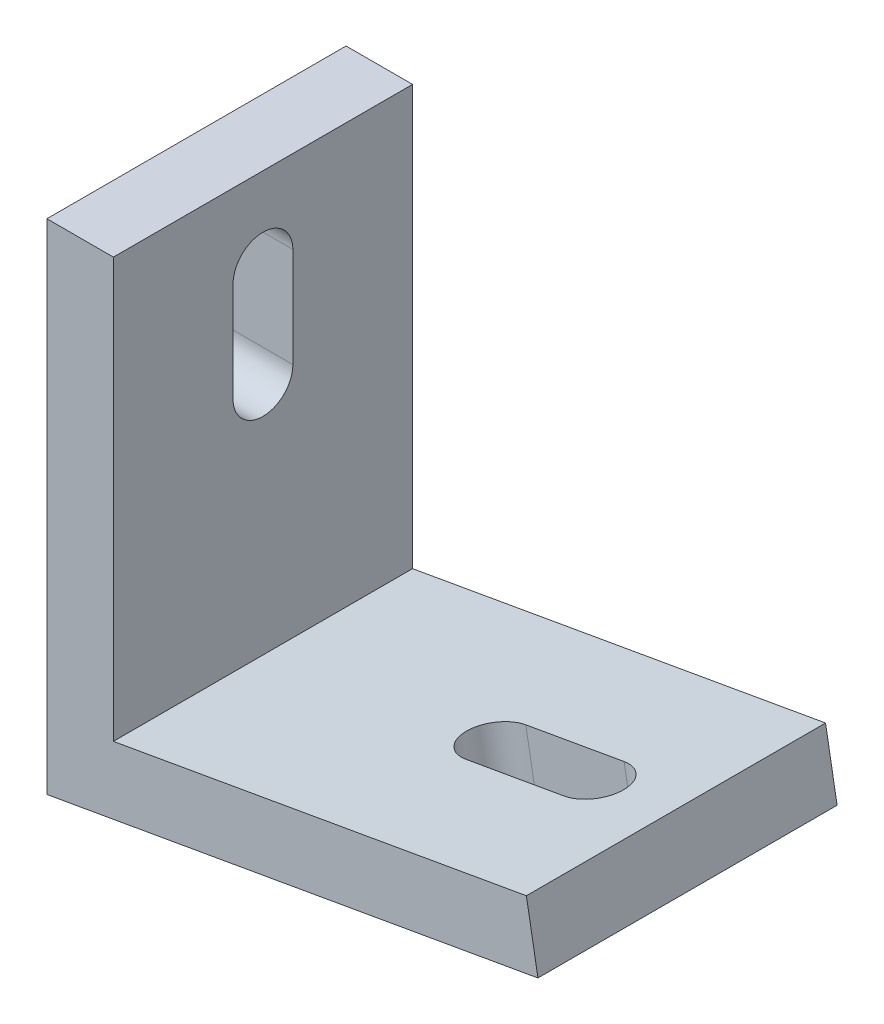
ISO-10303-21;
HEADER;
FILE_DESCRIPTION(('STEP AP214'),'2;1');
FILE_NAME('part.step','',(''),(''),'','','');
FILE_SCHEMA(('AUTOMOTIVE_DESIGN { 1 0 10303 214 1 1 1 1 }'));
ENDSEC;
DATA;
#1=APPLICATION_CONTEXT('core data for automotive mechanical design processes');
#2=APPLICATION_PROTOCOL_DEFINITION('international standard','automotive_design',2000,#1);
#3=PRODUCT_CONTEXT('',#1,'mechanical');
#4=PRODUCT('Part','Part','',(#3));
#5=PRODUCT_RELATED_PRODUCT_CATEGORY('part','',(#4));
#6=PRODUCT_DEFINITION_FORMATION('','',#4);
#7=PRODUCT_DEFINITION_CONTEXT('part definition',#1,'design');
#8=PRODUCT_DEFINITION('design','',#6,#7);
#9=PRODUCT_DEFINITION_SHAPE('','',#8);
#10=(LENGTH_UNIT() NAMED_UNIT(*) SI_UNIT(.MILLI.,.METRE.));
#11=(NAMED_UNIT(*) PLANE_ANGLE_UNIT() SI_UNIT($,.RADIAN.));
#12=(NAMED_UNIT(*) SI_UNIT($,.STERADIAN.) SOLID_ANGLE_UNIT());
#13=UNCERTAINTY_MEASURE_WITH_UNIT(LENGTH_MEASURE(1.E-05),#10,'distance_accuracy_value','');
#14=(GEOMETRIC_REPRESENTATION_CONTEXT(3) GLOBAL_UNCERTAINTY_ASSIGNED_CONTEXT((#13)) GLOBAL_UNIT_ASSIGNED_CONTEXT((#10,
#11,#12)) REPRESENTATION_CONTEXT('',''));
#15=CARTESIAN_POINT('',(0.,0.,0.));
#16=DIRECTION('',(0.,0.,1.));
#17=DIRECTION('',(1.,0.,0.));
#18=AXIS2_PLACEMENT_3D('',#15,#16,#17);
#19=CARTESIAN_POINT('',(72.1240996992464,22.8716908551416,22.5));
#20=DIRECTION('',(0.173648177666928,-0.984807753012208,0.));
#21=DIRECTION('',(0.984807753012209,0.173648177666928,0.));
#22=AXIS2_PLACEMENT_3D('',#19,#20,#21);
#23=PLANE('',#22);
#24=DIRECTION('',(-0.984807753012209,-0.173648177666928,0.));
#25=VECTOR('',#24,1.);
#26=CARTESIAN_POINT('',(72.1240996992464,22.8716908551416,-22.5));
#27=LINE('',#26,#25);
#28=CARTESIAN_POINT('',(72.1240996992464,22.8716908551416,-22.5));
#29=VERTEX_POINT('',#28);
#30=CARTESIAN_POINT('',(10.,11.917535925942,-22.5));
#31=VERTEX_POINT('',#30);
#32=EDGE_CURVE('E363',#29,#31,#27,.T.);
#33=ORIENTED_EDGE('',*,*,#32,.T.);
#34=DIRECTION('',(0.,0.,-1.));
#35=VECTOR('',#34,1.);
#36=CARTESIAN_POINT('',(10.,11.917535925942,22.5));
#37=LINE('',#36,#35);
#38=CARTESIAN_POINT('',(10.,11.917535925942,22.5));
#39=VERTEX_POINT('',#38);
#40=EDGE_CURVE('E377',#39,#31,#37,.T.);
#41=ORIENTED_EDGE('',*,*,#40,.F.);
#42=DIRECTION('',(-0.984807753012209,-0.173648177666928,0.));
#43=VECTOR('',#42,1.);
#44=CARTESIAN_POINT('',(72.1240996992464,22.8716908551416,22.5));
#45=LINE('',#44,#43);
#46=CARTESIAN_POINT('',(72.1240996992464,22.8716908551416,22.5));
#47=VERTEX_POINT('',#46);
#48=EDGE_CURVE('E349',#47,#39,#45,.T.);
#49=ORIENTED_EDGE('',*,*,#48,.F.);
#50=DIRECTION('',(0.,0.,-1.));
#51=VECTOR('',#50,1.);
#52=CARTESIAN_POINT('',(72.1240996992464,22.8716908551416,22.5));
#53=LINE('',#52,#51);
#54=EDGE_CURVE('E374',#47,#29,#53,.T.);
#55=ORIENTED_EDGE('',*,*,#54,.T.);
#56=EDGE_LOOP('',(#33,#41,#49,#55));
#57=FACE_BOUND('',#56,.T.);
#58=DIRECTION('',(0.984807753012209,0.173648177666928,0.));
#59=VECTOR('',#58,1.);
#60=CARTESIAN_POINT('',(72.1240996992464,22.8716908551416,4.49999999999999));
#61=LINE('',#60,#59);
#62=CARTESIAN_POINT('',(45.0418864914106,18.0963659693011,4.5));
#63=VERTEX_POINT('',#62);
#64=CARTESIAN_POINT('',(59.8140027865938,20.701088634305,4.5));
#65=VERTEX_POINT('',#64);
#66=EDGE_CURVE('E13',#63,#65,#61,.T.);
#67=ORIENTED_EDGE('',*,*,#66,.F.);
#68=CARTESIAN_POINT('',(45.0418864914106,18.0963659693011,0.));
#69=DIRECTION('',(0.173648177666928,-0.984807753012208,0.));
#70=DIRECTION('',(0.984807753012209,0.173648177666928,0.));
#71=AXIS2_PLACEMENT_3D('',#68,#69,#70);
#72=CIRCLE('',#71,4.5);
#73=CARTESIAN_POINT('',(45.0418864914106,18.0963659693011,-4.5));
#74=VERTEX_POINT('',#73);
#75=EDGE_CURVE('E398',#63,#74,#72,.T.);
#76=ORIENTED_EDGE('',*,*,#75,.T.);
#77=DIRECTION('',(0.984807753012209,0.173648177666928,0.));
#78=VECTOR('',#77,1.);
#79=CARTESIAN_POINT('',(72.1240996992464,22.8716908551416,-4.5));
#80=LINE('',#79,#78);
#81=CARTESIAN_POINT('',(59.8140027865938,20.701088634305,-4.5));
#82=VERTEX_POINT('',#81);
#83=EDGE_CURVE('E395',#74,#82,#80,.T.);
#84=ORIENTED_EDGE('',*,*,#83,.T.);
#85=CARTESIAN_POINT('',(59.8140027865938,20.701088634305,0.));
#86=DIRECTION('',(0.173648177666928,-0.984807753012208,0.));
#87=DIRECTION('',(0.984807753012209,0.173648177666928,0.));
#88=AXIS2_PLACEMENT_3D('',#85,#86,#87);
#89=CIRCLE('',#88,4.5);
#90=EDGE_CURVE('E199',#82,#65,#89,.T.);
#91=ORIENTED_EDGE('',*,*,#90,.T.);
#92=EDGE_LOOP('',(#67,#76,#84,#91));
#93=FACE_BOUND('',#92,.T.);
#94=ADVANCED_FACE('F191',(#57,#93),#23,.F.);
#95=CARTESIAN_POINT('',(0.,0.,22.5));
#96=DIRECTION('',(-1.,0.,0.));
#97=DIRECTION('',(0.,0.,1.));
#98=AXIS2_PLACEMENT_3D('',#95,#96,#97);
#99=PLANE('',#98);
#100=CARTESIAN_POINT('',(0.,62.5,0.));
#101=DIRECTION('',(-1.,0.,0.));
#102=DIRECTION('',(0.,0.,1.));
#103=AXIS2_PLACEMENT_3D('',#100,#101,#102);
#104=CIRCLE('',#103,4.5);
#105=CARTESIAN_POINT('',(0.,62.5,4.49999999999998));
#106=VERTEX_POINT('',#105);
#107=CARTESIAN_POINT('',(0.,62.5,-4.5));
#108=VERTEX_POINT('',#107);
#109=EDGE_CURVE('E332',#106,#108,#104,.T.);
#110=ORIENTED_EDGE('',*,*,#109,.F.);
#111=DIRECTION('',(0.,1.,0.));
#112=VECTOR('',#111,1.);
#113=CARTESIAN_POINT('',(0.,47.5,4.49999999999998));
#114=LINE('',#113,#112);
#115=CARTESIAN_POINT('',(0.,47.5,4.5));
#116=VERTEX_POINT('',#115);
#117=EDGE_CURVE('E319',#116,#106,#114,.T.);
#118=ORIENTED_EDGE('',*,*,#117,.F.);
#119=CARTESIAN_POINT('',(0.,47.5,0.));
#120=DIRECTION('',(-1.,0.,0.));
#121=DIRECTION('',(0.,0.,1.));
#122=AXIS2_PLACEMENT_3D('',#119,#120,#121);
#123=CIRCLE('',#122,4.5);
#124=CARTESIAN_POINT('',(0.,47.5,-4.5));
#125=VERTEX_POINT('',#124);
#126=EDGE_CURVE('E324',#125,#116,#123,.T.);
#127=ORIENTED_EDGE('',*,*,#126,.F.);
#128=DIRECTION('',(0.,1.,0.));
#129=VECTOR('',#128,1.);
#130=CARTESIAN_POINT('',(0.,47.5,-4.5));
#131=LINE('',#130,#129);
#132=EDGE_CURVE('E321',#125,#108,#131,.T.);
#133=ORIENTED_EDGE('',*,*,#132,.T.);
#134=EDGE_LOOP('',(#110,#118,#127,#133));
#135=FACE_BOUND('',#134,.T.);
#136=DIRECTION('',(0.,1.,0.));
#137=VECTOR('',#136,1.);
#138=CARTESIAN_POINT('',(0.,0.,-22.5));
#139=LINE('',#138,#137);
#140=CARTESIAN_POINT('',(0.,0.,-22.5));
#141=VERTEX_POINT('',#140);
#142=CARTESIAN_POINT('',(0.,75.,-22.5));
#143=VERTEX_POINT('',#142);
#144=EDGE_CURVE('E340',#141,#143,#139,.T.);
#145=ORIENTED_EDGE('',*,*,#144,.F.);
#146=DIRECTION('',(0.,0.,-1.));
#147=VECTOR('',#146,1.);
#148=CARTESIAN_POINT('',(0.,0.,22.5));
#149=LINE('',#148,#147);
#150=CARTESIAN_POINT('',(0.,0.,22.5));
#151=VERTEX_POINT('',#150);
#152=EDGE_CURVE('E368',#151,#141,#149,.T.);
#153=ORIENTED_EDGE('',*,*,#152,.F.);
#154=DIRECTION('',(0.,1.,0.));
#155=VECTOR('',#154,1.);
#156=CARTESIAN_POINT('',(0.,0.,22.5));
#157=LINE('',#156,#155);
#158=CARTESIAN_POINT('',(0.,75.,22.5));
#159=VERTEX_POINT('',#158);
#160=EDGE_CURVE('E341',#151,#159,#157,.T.);
#161=ORIENTED_EDGE('',*,*,#160,.T.);
#162=DIRECTION('',(0.,0.,-1.));
#163=VECTOR('',#162,1.);
#164=CARTESIAN_POINT('',(0.,75.,22.5));
#165=LINE('',#164,#163);
#166=EDGE_CURVE('E355',#159,#143,#165,.T.);
#167=ORIENTED_EDGE('',*,*,#166,.T.);
#168=EDGE_LOOP('',(#145,#153,#161,#167));
#169=FACE_BOUND('',#168,.T.);
#170=ADVANCED_FACE('F193',(#135,#169),#99,.T.);
#171=CARTESIAN_POINT('',(0.,0.,22.5));
#172=DIRECTION('',(-0.173648177666927,0.984807753012208,0.));
#173=DIRECTION('',(-0.984807753012209,-0.173648177666927,0.));
#174=AXIS2_PLACEMENT_3D('',#171,#172,#173);
#175=PLANE('',#174);
#176=CARTESIAN_POINT('',(61.550484563263,10.853011104183,0.));
#177=DIRECTION('',(0.173648177666928,-0.984807753012209,0.));
#178=DIRECTION('',(0.984807753012209,0.173648177666928,0.));
#179=AXIS2_PLACEMENT_3D('',#176,#177,#178);
#180=CIRCLE('',#179,4.5);
#181=CARTESIAN_POINT('',(61.550484563263,10.853011104183,-4.49999999999998));
#182=VERTEX_POINT('',#181);
#183=CARTESIAN_POINT('',(61.550484563263,10.853011104183,4.5));
#184=VERTEX_POINT('',#183);
#185=EDGE_CURVE('E291',#182,#184,#180,.T.);
#186=ORIENTED_EDGE('',*,*,#185,.F.);
#187=DIRECTION('',(0.984807753012208,0.173648177666927,0.));
#188=VECTOR('',#187,1.);
#189=CARTESIAN_POINT('',(46.7783682680799,8.24828843917905,-4.49999999999997));
#190=LINE('',#189,#188);
#191=CARTESIAN_POINT('',(46.7783682680799,8.24828843917905,-4.5));
#192=VERTEX_POINT('',#191);
#193=EDGE_CURVE('E311',#192,#182,#190,.T.);
#194=ORIENTED_EDGE('',*,*,#193,.F.);
#195=CARTESIAN_POINT('',(46.7783682680799,8.24828843917905,0.));
#196=DIRECTION('',(0.173648177666928,-0.984807753012209,0.));
#197=DIRECTION('',(0.984807753012209,0.173648177666928,0.));
#198=AXIS2_PLACEMENT_3D('',#195,#196,#197);
#199=CIRCLE('',#198,4.5);
#200=CARTESIAN_POINT('',(46.7783682680799,8.24828843917905,4.5));
#201=VERTEX_POINT('',#200);
#202=EDGE_CURVE('E310',#201,#192,#199,.T.);
#203=ORIENTED_EDGE('',*,*,#202,.F.);
#204=DIRECTION('',(0.984807753012208,0.173648177666927,0.));
#205=VECTOR('',#204,1.);
#206=CARTESIAN_POINT('',(46.7783682680799,8.24828843917905,4.5));
#207=LINE('',#206,#205);
#208=EDGE_CURVE('E304',#201,#184,#207,.T.);
#209=ORIENTED_EDGE('',*,*,#208,.T.);
#210=EDGE_LOOP('',(#186,#194,#203,#209));
#211=FACE_BOUND('',#210,.T.);
#212=DIRECTION('',(0.984807753012208,0.173648177666927,0.));
#213=VECTOR('',#212,1.);
#214=CARTESIAN_POINT('',(0.,0.,-22.5));
#215=LINE('',#214,#213);
#216=CARTESIAN_POINT('',(73.8605814759156,13.0236133250196,-22.5));
#217=VERTEX_POINT('',#216);
#218=EDGE_CURVE('E345',#141,#217,#215,.T.);
#219=ORIENTED_EDGE('',*,*,#218,.T.);
#220=DIRECTION('',(0.,0.,-1.));
#221=VECTOR('',#220,1.);
#222=CARTESIAN_POINT('',(73.8605814759156,13.0236133250196,22.5));
#223=LINE('',#222,#221);
#224=CARTESIAN_POINT('',(73.8605814759156,13.0236133250196,22.5));
#225=VERTEX_POINT('',#224);
#226=EDGE_CURVE('E371',#225,#217,#223,.T.);
#227=ORIENTED_EDGE('',*,*,#226,.F.);
#228=DIRECTION('',(0.984807753012208,0.173648177666927,0.));
#229=VECTOR('',#228,1.);
#230=CARTESIAN_POINT('',(0.,0.,22.5));
#231=LINE('',#230,#229);
#232=EDGE_CURVE('E353',#151,#225,#231,.T.);
#233=ORIENTED_EDGE('',*,*,#232,.F.);
#234=ORIENTED_EDGE('',*,*,#152,.T.);
#235=EDGE_LOOP('',(#219,#227,#233,#234));
#236=FACE_BOUND('',#235,.T.);
#237=ADVANCED_FACE('F308',(#211,#236),#175,.F.);
#238=CARTESIAN_POINT('',(73.8605814759156,13.0236133250196,22.5));
#239=DIRECTION('',(-0.984807753012208,-0.173648177666928,0.));
#240=DIRECTION('',(0.173648177666928,-0.984807753012209,0.));
#241=AXIS2_PLACEMENT_3D('',#238,#239,#240);
#242=PLANE('',#241);
#243=DIRECTION('',(-0.173648177666928,0.984807753012209,0.));
#244=VECTOR('',#243,1.);
#245=CARTESIAN_POINT('',(73.8605814759156,13.0236133250196,-22.5));
#246=LINE('',#245,#244);
#247=EDGE_CURVE('E365',#217,#29,#246,.T.);
#248=ORIENTED_EDGE('',*,*,#247,.T.);
#249=ORIENTED_EDGE('',*,*,#54,.F.);
#250=DIRECTION('',(-0.173648177666928,0.984807753012209,0.));
#251=VECTOR('',#250,1.);
#252=CARTESIAN_POINT('',(73.8605814759156,13.0236133250196,22.5));
#253=LINE('',#252,#251);
#254=EDGE_CURVE('E351',#225,#47,#253,.T.);
#255=ORIENTED_EDGE('',*,*,#254,.F.);
#256=ORIENTED_EDGE('',*,*,#226,.T.);
#257=EDGE_LOOP('',(#248,#249,#255,#256));
#258=FACE_BOUND('',#257,.T.);
#259=ADVANCED_FACE('F424',(#258),#242,.F.);
#260=CARTESIAN_POINT('',(10.,11.917535925942,22.5));
#261=DIRECTION('',(-1.,0.,0.));
#262=DIRECTION('',(0.,-1.,0.));
#263=AXIS2_PLACEMENT_3D('',#260,#261,#262);
#264=PLANE('',#263);
#265=CARTESIAN_POINT('',(10.,62.5,0.));
#266=DIRECTION('',(-1.,0.,0.));
#267=DIRECTION('',(0.,-1.,0.));
#268=AXIS2_PLACEMENT_3D('',#265,#266,#267);
#269=CIRCLE('',#268,4.5);
#270=CARTESIAN_POINT('',(10.,62.5,4.5));
#271=VERTEX_POINT('',#270);
#272=CARTESIAN_POINT('',(10.,62.5,-4.5));
#273=VERTEX_POINT('',#272);
#274=EDGE_CURVE('E389',#271,#273,#269,.T.);
#275=ORIENTED_EDGE('',*,*,#274,.T.);
#276=DIRECTION('',(0.,-1.,0.));
#277=VECTOR('',#276,1.);
#278=CARTESIAN_POINT('',(10.,11.917535925942,-4.49999999999999));
#279=LINE('',#278,#277);
#280=CARTESIAN_POINT('',(10.,47.5,-4.5));
#281=VERTEX_POINT('',#280);
#282=EDGE_CURVE('E392',#273,#281,#279,.T.);
#283=ORIENTED_EDGE('',*,*,#282,.T.);
#284=CARTESIAN_POINT('',(10.,47.5,0.));
#285=DIRECTION('',(-1.,0.,0.));
#286=DIRECTION('',(0.,-1.,0.));
#287=AXIS2_PLACEMENT_3D('',#284,#285,#286);
#288=CIRCLE('',#287,4.5);
#289=CARTESIAN_POINT('',(10.,47.5,4.5));
#290=VERTEX_POINT('',#289);
#291=EDGE_CURVE('E386',#281,#290,#288,.T.);
#292=ORIENTED_EDGE('',*,*,#291,.T.);
#293=DIRECTION('',(0.,1.,0.));
#294=VECTOR('',#293,1.);
#295=CARTESIAN_POINT('',(10.,11.917535925942,4.5));
#296=LINE('',#295,#294);
#297=EDGE_CURVE('E370',#290,#271,#296,.T.);
#298=ORIENTED_EDGE('',*,*,#297,.T.);
#299=EDGE_LOOP('',(#275,#283,#292,#298));
#300=FACE_BOUND('',#299,.T.);
#301=DIRECTION('',(0.,1.,0.));
#302=VECTOR('',#301,1.);
#303=CARTESIAN_POINT('',(10.,11.917535925942,-22.5));
#304=LINE('',#303,#302);
#305=CARTESIAN_POINT('',(10.,75.,-22.5));
#306=VERTEX_POINT('',#305);
#307=EDGE_CURVE('E361',#31,#306,#304,.T.);
#308=ORIENTED_EDGE('',*,*,#307,.T.);
#309=DIRECTION('',(0.,0.,-1.));
#310=VECTOR('',#309,1.);
#311=CARTESIAN_POINT('',(10.,75.,22.5));
#312=LINE('',#311,#310);
#313=CARTESIAN_POINT('',(10.,75.,22.5));
#314=VERTEX_POINT('',#313);
#315=EDGE_CURVE('E380',#314,#306,#312,.T.);
#316=ORIENTED_EDGE('',*,*,#315,.F.);
#317=DIRECTION('',(0.,1.,0.));
#318=VECTOR('',#317,1.);
#319=CARTESIAN_POINT('',(10.,11.917535925942,22.5));
#320=LINE('',#319,#318);
#321=EDGE_CURVE('E347',#39,#314,#320,.T.);
#322=ORIENTED_EDGE('',*,*,#321,.F.);
#323=ORIENTED_EDGE('',*,*,#40,.T.);
#324=EDGE_LOOP('',(#308,#316,#322,#323));
#325=FACE_BOUND('',#324,.T.);
#326=ADVANCED_FACE('F426',(#300,#325),#264,.F.);
#327=CARTESIAN_POINT('',(10.,75.,22.5));
#328=DIRECTION('',(0.,-1.,0.));
#329=DIRECTION('',(0.,0.,-1.));
#330=AXIS2_PLACEMENT_3D('',#327,#328,#329);
#331=PLANE('',#330);
#332=DIRECTION('',(-1.,0.,0.));
#333=VECTOR('',#332,1.);
#334=CARTESIAN_POINT('',(10.,75.,-22.5));
#335=LINE('',#334,#333);
#336=EDGE_CURVE('E358',#306,#143,#335,.T.);
#337=ORIENTED_EDGE('',*,*,#336,.T.);
#338=ORIENTED_EDGE('',*,*,#166,.F.);
#339=DIRECTION('',(-1.,0.,0.));
#340=VECTOR('',#339,1.);
#341=CARTESIAN_POINT('',(10.,75.,22.5));
#342=LINE('',#341,#340);
#343=EDGE_CURVE('E344',#314,#159,#342,.T.);
#344=ORIENTED_EDGE('',*,*,#343,.F.);
#345=ORIENTED_EDGE('',*,*,#315,.T.);
#346=EDGE_LOOP('',(#337,#338,#344,#345));
#347=FACE_BOUND('',#346,.T.);
#348=ADVANCED_FACE('F428',(#347),#331,.F.);
#349=CARTESIAN_POINT('',(0.,0.,22.5));
#350=DIRECTION('',(0.,0.,1.));
#351=DIRECTION('',(1.,0.,0.));
#352=AXIS2_PLACEMENT_3D('',#349,#350,#351);
#353=PLANE('',#352);
#354=ORIENTED_EDGE('',*,*,#160,.F.);
#355=ORIENTED_EDGE('',*,*,#232,.T.);
#356=ORIENTED_EDGE('',*,*,#254,.T.);
#357=ORIENTED_EDGE('',*,*,#48,.T.);
#358=ORIENTED_EDGE('',*,*,#321,.T.);
#359=ORIENTED_EDGE('',*,*,#343,.T.);
#360=EDGE_LOOP('',(#354,#355,#356,#357,#358,#359));
#361=FACE_BOUND('',#360,.T.);
#362=ADVANCED_FACE('F431',(#361),#353,.T.);
#363=CARTESIAN_POINT('',(0.,0.,-22.5));
#364=DIRECTION('',(0.,0.,1.));
#365=DIRECTION('',(1.,0.,0.));
#366=AXIS2_PLACEMENT_3D('',#363,#364,#365);
#367=PLANE('',#366);
#368=ORIENTED_EDGE('',*,*,#144,.T.);
#369=ORIENTED_EDGE('',*,*,#336,.F.);
#370=ORIENTED_EDGE('',*,*,#307,.F.);
#371=ORIENTED_EDGE('',*,*,#32,.F.);
#372=ORIENTED_EDGE('',*,*,#247,.F.);
#373=ORIENTED_EDGE('',*,*,#218,.F.);
#374=EDGE_LOOP('',(#368,#369,#370,#371,#372,#373));
#375=FACE_BOUND('',#374,.T.);
#376=ADVANCED_FACE('F437',(#375),#367,.F.);
#377=CARTESIAN_POINT('',(0.,62.5,0.));
#378=DIRECTION('',(-1.,0.,0.));
#379=DIRECTION('',(0.,0.,1.));
#380=AXIS2_PLACEMENT_3D('',#377,#378,#379);
#381=CYLINDRICAL_SURFACE('',#380,4.5);
#382=DIRECTION('',(-1.,0.,0.));
#383=VECTOR('',#382,1.);
#384=CARTESIAN_POINT('',(0.,62.5,4.5));
#385=LINE('',#384,#383);
#386=EDGE_CURVE('E337',#106,#271,#385,.F.);
#387=ORIENTED_EDGE('',*,*,#386,.F.);
#388=ORIENTED_EDGE('',*,*,#109,.T.);
#389=DIRECTION('',(-1.,0.,0.));
#390=VECTOR('',#389,1.);
#391=CARTESIAN_POINT('',(0.,62.5,-4.5));
#392=LINE('',#391,#390);
#393=EDGE_CURVE('E335',#273,#108,#392,.T.);
#394=ORIENTED_EDGE('',*,*,#393,.F.);
#395=ORIENTED_EDGE('',*,*,#274,.F.);
#396=EDGE_LOOP('',(#387,#388,#394,#395));
#397=FACE_BOUND('',#396,.T.);
#398=ADVANCED_FACE('F465',(#397),#381,.F.);
#399=CARTESIAN_POINT('',(0.,47.5,0.));
#400=DIRECTION('',(-1.,0.,0.));
#401=DIRECTION('',(0.,0.,1.));
#402=AXIS2_PLACEMENT_3D('',#399,#400,#401);
#403=CYLINDRICAL_SURFACE('',#402,4.5);
#404=DIRECTION('',(-1.,0.,0.));
#405=VECTOR('',#404,1.);
#406=CARTESIAN_POINT('',(0.,47.5,-4.5));
#407=LINE('',#406,#405);
#408=EDGE_CURVE('E329',#125,#281,#407,.F.);
#409=ORIENTED_EDGE('',*,*,#408,.F.);
#410=ORIENTED_EDGE('',*,*,#126,.T.);
#411=DIRECTION('',(-1.,0.,0.));
#412=VECTOR('',#411,1.);
#413=CARTESIAN_POINT('',(0.,47.5,4.5));
#414=LINE('',#413,#412);
#415=EDGE_CURVE('E327',#290,#116,#414,.T.);
#416=ORIENTED_EDGE('',*,*,#415,.F.);
#417=ORIENTED_EDGE('',*,*,#291,.F.);
#418=EDGE_LOOP('',(#409,#410,#416,#417));
#419=FACE_BOUND('',#418,.T.);
#420=ADVANCED_FACE('F469',(#419),#403,.F.);
#421=CARTESIAN_POINT('',(0.,47.5,-4.5));
#422=DIRECTION('',(0.,0.,-1.));
#423=DIRECTION('',(0.,1.,0.));
#424=AXIS2_PLACEMENT_3D('',#421,#422,#423);
#425=PLANE('',#424);
#426=ORIENTED_EDGE('',*,*,#393,.T.);
#427=ORIENTED_EDGE('',*,*,#132,.F.);
#428=ORIENTED_EDGE('',*,*,#408,.T.);
#429=ORIENTED_EDGE('',*,*,#282,.F.);
#430=EDGE_LOOP('',(#426,#427,#428,#429));
#431=FACE_BOUND('',#430,.T.);
#432=ADVANCED_FACE('F473',(#431),#425,.F.);
#433=CARTESIAN_POINT('',(0.,47.5,4.5));
#434=DIRECTION('',(0.,0.,1.));
#435=DIRECTION('',(0.,-1.,0.));
#436=AXIS2_PLACEMENT_3D('',#433,#434,#435);
#437=PLANE('',#436);
#438=ORIENTED_EDGE('',*,*,#415,.T.);
#439=ORIENTED_EDGE('',*,*,#117,.T.);
#440=ORIENTED_EDGE('',*,*,#386,.T.);
#441=ORIENTED_EDGE('',*,*,#297,.F.);
#442=EDGE_LOOP('',(#438,#439,#440,#441));
#443=FACE_BOUND('',#442,.T.);
#444=ADVANCED_FACE('F411',(#443),#437,.F.);
#445=CARTESIAN_POINT('',(61.550484563263,10.853011104183,0.));
#446=DIRECTION('',(0.173648177666928,-0.984807753012209,0.));
#447=DIRECTION('',(0.984807753012209,0.173648177666928,0.));
#448=AXIS2_PLACEMENT_3D('',#445,#446,#447);
#449=CYLINDRICAL_SURFACE('',#448,4.5);
#450=DIRECTION('',(0.173648177666928,-0.984807753012209,0.));
#451=VECTOR('',#450,1.);
#452=CARTESIAN_POINT('',(61.550484563263,10.853011104183,-4.5));
#453=LINE('',#452,#451);
#454=EDGE_CURVE('E297',#182,#82,#453,.F.);
#455=ORIENTED_EDGE('',*,*,#454,.F.);
#456=ORIENTED_EDGE('',*,*,#185,.T.);
#457=DIRECTION('',(-0.173648177666928,0.984807753012209,0.));
#458=VECTOR('',#457,1.);
#459=CARTESIAN_POINT('',(57.9405308033843,31.3260762322441,4.5));
#460=LINE('',#459,#458);
#461=EDGE_CURVE('E294',#184,#65,#460,.T.);
#462=ORIENTED_EDGE('',*,*,#461,.T.);
#463=ORIENTED_EDGE('',*,*,#90,.F.);
#464=EDGE_LOOP('',(#455,#456,#462,#463));
#465=FACE_BOUND('',#464,.T.);
#466=ADVANCED_FACE('F293',(#465),#449,.F.);
#467=CARTESIAN_POINT('',(46.7783682680799,8.24828843917905,0.));
#468=DIRECTION('',(0.173648177666928,-0.984807753012209,0.));
#469=DIRECTION('',(0.984807753012209,0.173648177666928,0.));
#470=AXIS2_PLACEMENT_3D('',#467,#468,#469);
#471=CYLINDRICAL_SURFACE('',#470,4.5);
#472=DIRECTION('',(-0.173648177666928,0.984807753012209,0.));
#473=VECTOR('',#472,1.);
#474=CARTESIAN_POINT('',(43.1684145082012,28.7213535672402,4.5));
#475=LINE('',#474,#473);
#476=EDGE_CURVE('E206',#201,#63,#475,.T.);
#477=ORIENTED_EDGE('',*,*,#476,.F.);
#478=ORIENTED_EDGE('',*,*,#202,.T.);
#479=DIRECTION('',(0.173648177666928,-0.984807753012209,0.));
#480=VECTOR('',#479,1.);
#481=CARTESIAN_POINT('',(46.7783682680799,8.24828843917905,-4.5));
#482=LINE('',#481,#480);
#483=EDGE_CURVE('E211',#74,#192,#482,.T.);
#484=ORIENTED_EDGE('',*,*,#483,.F.);
#485=ORIENTED_EDGE('',*,*,#75,.F.);
#486=EDGE_LOOP('',(#477,#478,#484,#485));
#487=FACE_BOUND('',#486,.T.);
#488=ADVANCED_FACE('F403',(#487),#471,.F.);
#489=CARTESIAN_POINT('',(43.1684145082012,28.7213535672402,4.5));
#490=DIRECTION('',(0.,0.,-1.));
#491=DIRECTION('',(-1.,0.,0.));
#492=AXIS2_PLACEMENT_3D('',#489,#490,#491);
#493=PLANE('',#492);
#494=ORIENTED_EDGE('',*,*,#66,.T.);
#495=ORIENTED_EDGE('',*,*,#461,.F.);
#496=ORIENTED_EDGE('',*,*,#208,.F.);
#497=ORIENTED_EDGE('',*,*,#476,.T.);
#498=EDGE_LOOP('',(#494,#495,#496,#497));
#499=FACE_BOUND('',#498,.T.);
#500=ADVANCED_FACE('F303',(#499),#493,.T.);
#501=CARTESIAN_POINT('',(46.7783682680799,8.24828843917905,-4.5));
#502=DIRECTION('',(0.,0.,-1.));
#503=DIRECTION('',(-1.,0.,0.));
#504=AXIS2_PLACEMENT_3D('',#501,#502,#503);
#505=PLANE('',#504);
#506=ORIENTED_EDGE('',*,*,#483,.T.);
#507=ORIENTED_EDGE('',*,*,#193,.T.);
#508=ORIENTED_EDGE('',*,*,#454,.T.);
#509=ORIENTED_EDGE('',*,*,#83,.F.);
#510=EDGE_LOOP('',(#506,#507,#508,#509));
#511=FACE_BOUND('',#510,.T.);
#512=ADVANCED_FACE('F402',(#511),#505,.F.);
#513=CLOSED_SHELL('',(#94,#170,#237,#259,#326,#348,#362,#376,#398,#420,#432,#444,#466,#488,#500,#512));
#514=MANIFOLD_SOLID_BREP('B2',#513);
#515=ADVANCED_BREP_SHAPE_REPRESENTATION('',(#18,#514),#14);
#516=SHAPE_DEFINITION_REPRESENTATION(#9,#515);
ENDSEC;
END-ISO-10303-21;
